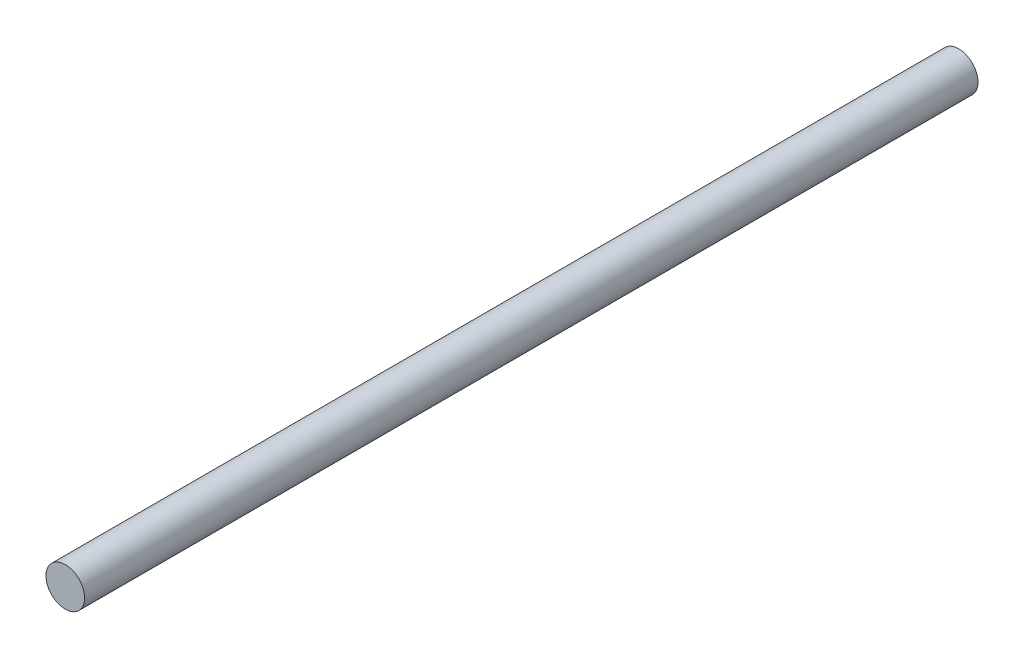
ISO-10303-21;
HEADER;
FILE_DESCRIPTION(('STEP AP214'),'2;1');
FILE_NAME('part.step','',(''),(''),'','','');
FILE_SCHEMA(('AUTOMOTIVE_DESIGN { 1 0 10303 214 1 1 1 1 }'));
ENDSEC;
DATA;
#1=APPLICATION_CONTEXT('core data for automotive mechanical design processes');
#2=APPLICATION_PROTOCOL_DEFINITION('international standard','automotive_design',2000,#1);
#3=PRODUCT_CONTEXT('',#1,'mechanical');
#4=PRODUCT('Part','Part','',(#3));
#5=PRODUCT_RELATED_PRODUCT_CATEGORY('part','',(#4));
#6=PRODUCT_DEFINITION_FORMATION('','',#4);
#7=PRODUCT_DEFINITION_CONTEXT('part definition',#1,'design');
#8=PRODUCT_DEFINITION('design','',#6,#7);
#9=PRODUCT_DEFINITION_SHAPE('','',#8);
#10=(LENGTH_UNIT() NAMED_UNIT(*) SI_UNIT(.MILLI.,.METRE.));
#11=(NAMED_UNIT(*) PLANE_ANGLE_UNIT() SI_UNIT($,.RADIAN.));
#12=(NAMED_UNIT(*) SI_UNIT($,.STERADIAN.) SOLID_ANGLE_UNIT());
#13=UNCERTAINTY_MEASURE_WITH_UNIT(LENGTH_MEASURE(1.E-05),#10,'distance_accuracy_value','');
#14=(GEOMETRIC_REPRESENTATION_CONTEXT(3) GLOBAL_UNCERTAINTY_ASSIGNED_CONTEXT((#13)) GLOBAL_UNIT_ASSIGNED_CONTEXT((#10,
#11,#12)) REPRESENTATION_CONTEXT('',''));
#15=CARTESIAN_POINT('',(0.,0.,0.));
#16=DIRECTION('',(0.,0.,1.));
#17=DIRECTION('',(1.,0.,0.));
#18=AXIS2_PLACEMENT_3D('',#15,#16,#17);
#19=CARTESIAN_POINT('',(-5.98713688873571,4.96448928351687,185.));
#20=DIRECTION('',(0.,0.,-1.));
#21=DIRECTION('',(-1.,0.,0.));
#22=AXIS2_PLACEMENT_3D('',#19,#20,#21);
#23=CYLINDRICAL_SURFACE('',#22,4.);
#24=CARTESIAN_POINT('',(-5.98713688873571,4.96448928351687,185.));
#25=DIRECTION('',(0.,0.,1.));
#26=DIRECTION('',(1.,0.,0.));
#27=AXIS2_PLACEMENT_3D('',#24,#25,#26);
#28=CIRCLE('',#27,4.);
#29=CARTESIAN_POINT('',(-1.98713688873571,4.96448928351687,185.));
#30=VERTEX_POINT('',#29);
#31=EDGE_CURVE('E10',#30,#30,#28,.T.);
#32=ORIENTED_EDGE('',*,*,#31,.F.);
#33=EDGE_LOOP('',(#32));
#34=FACE_BOUND('',#33,.T.);
#35=CARTESIAN_POINT('',(-5.98713688873571,4.96448928351687,0.));
#36=DIRECTION('',(0.,0.,1.));
#37=DIRECTION('',(1.,0.,0.));
#38=AXIS2_PLACEMENT_3D('',#35,#36,#37);
#39=CIRCLE('',#38,4.);
#40=CARTESIAN_POINT('',(-1.98713688873571,4.96448928351687,0.));
#41=VERTEX_POINT('',#40);
#42=EDGE_CURVE('E33',#41,#41,#39,.T.);
#43=ORIENTED_EDGE('',*,*,#42,.T.);
#44=EDGE_LOOP('',(#43));
#45=FACE_BOUND('',#44,.T.);
#46=ADVANCED_FACE('F30',(#34,#45),#23,.T.);
#47=CARTESIAN_POINT('',(-5.98713688873571,4.96448928351687,185.));
#48=DIRECTION('',(0.,0.,1.));
#49=DIRECTION('',(1.,0.,0.));
#50=AXIS2_PLACEMENT_3D('',#47,#48,#49);
#51=PLANE('',#50);
#52=ORIENTED_EDGE('',*,*,#31,.T.);
#53=EDGE_LOOP('',(#52));
#54=FACE_BOUND('',#53,.T.);
#55=ADVANCED_FACE('F45',(#54),#51,.T.);
#56=CARTESIAN_POINT('',(-5.98713688873571,4.96448928351687,0.));
#57=DIRECTION('',(0.,0.,1.));
#58=DIRECTION('',(1.,0.,0.));
#59=AXIS2_PLACEMENT_3D('',#56,#57,#58);
#60=PLANE('',#59);
#61=ORIENTED_EDGE('',*,*,#42,.F.);
#62=EDGE_LOOP('',(#61));
#63=FACE_BOUND('',#62,.T.);
#64=ADVANCED_FACE('F43',(#63),#60,.F.);
#65=CLOSED_SHELL('',(#46,#55,#64));
#66=MANIFOLD_SOLID_BREP('B2',#65);
#67=ADVANCED_BREP_SHAPE_REPRESENTATION('',(#18,#66),#14);
#68=SHAPE_DEFINITION_REPRESENTATION(#9,#67);
ENDSEC;
END-ISO-10303-21;
